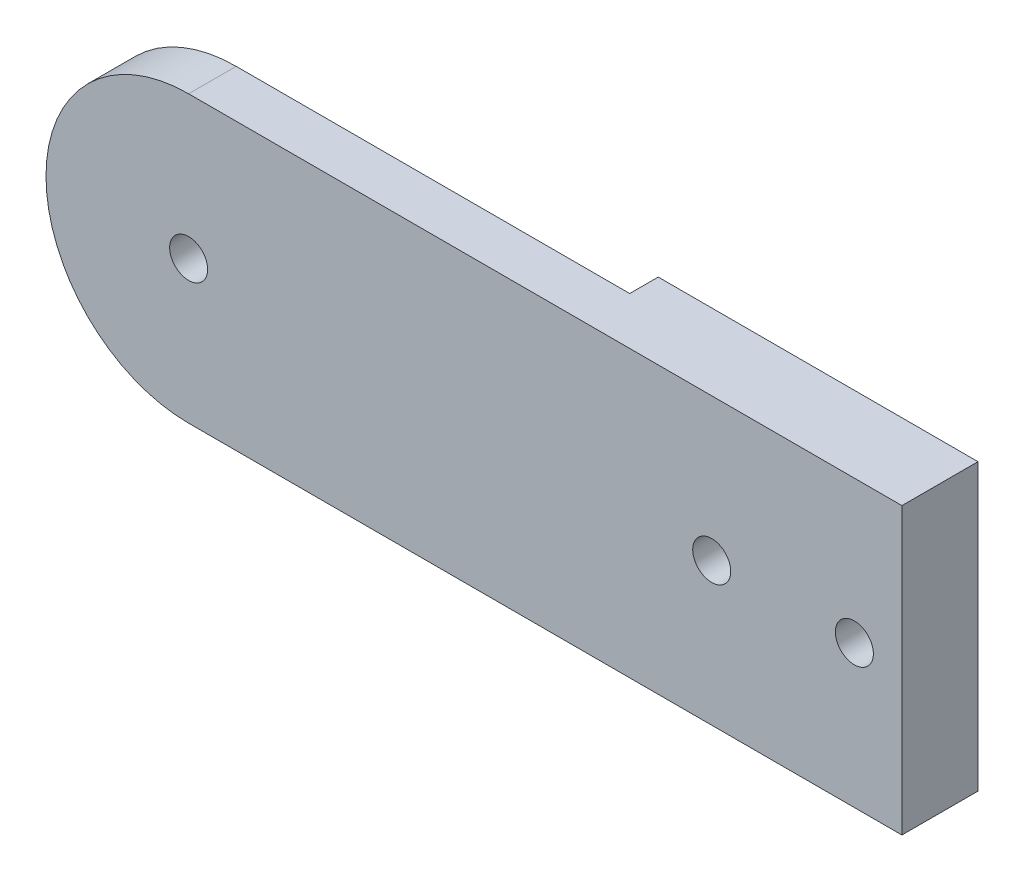
ISO-10303-21;
HEADER;
FILE_DESCRIPTION(('STEP AP214'),'2;1');
FILE_NAME('part.step','',(''),(''),'','','');
FILE_SCHEMA(('AUTOMOTIVE_DESIGN { 1 0 10303 214 1 1 1 1 }'));
ENDSEC;
DATA;
#1=APPLICATION_CONTEXT('core data for automotive mechanical design processes');
#2=APPLICATION_PROTOCOL_DEFINITION('international standard','automotive_design',2000,#1);
#3=PRODUCT_CONTEXT('',#1,'mechanical');
#4=PRODUCT('Part','Part','',(#3));
#5=PRODUCT_RELATED_PRODUCT_CATEGORY('part','',(#4));
#6=PRODUCT_DEFINITION_FORMATION('','',#4);
#7=PRODUCT_DEFINITION_CONTEXT('part definition',#1,'design');
#8=PRODUCT_DEFINITION('design','',#6,#7);
#9=PRODUCT_DEFINITION_SHAPE('','',#8);
#10=(LENGTH_UNIT() NAMED_UNIT(*) SI_UNIT(.MILLI.,.METRE.));
#11=(NAMED_UNIT(*) PLANE_ANGLE_UNIT() SI_UNIT($,.RADIAN.));
#12=(NAMED_UNIT(*) SI_UNIT($,.STERADIAN.) SOLID_ANGLE_UNIT());
#13=UNCERTAINTY_MEASURE_WITH_UNIT(LENGTH_MEASURE(1.E-05),#10,'distance_accuracy_value','');
#14=(GEOMETRIC_REPRESENTATION_CONTEXT(3) GLOBAL_UNCERTAINTY_ASSIGNED_CONTEXT((#13)) GLOBAL_UNIT_ASSIGNED_CONTEXT((#10,
#11,#12)) REPRESENTATION_CONTEXT('',''));
#15=CARTESIAN_POINT('',(0.,0.,0.));
#16=DIRECTION('',(0.,0.,1.));
#17=DIRECTION('',(1.,0.,0.));
#18=AXIS2_PLACEMENT_3D('',#15,#16,#17);
#19=CARTESIAN_POINT('',(-30.,0.,0.));
#20=DIRECTION('',(0.,0.,1.));
#21=DIRECTION('',(1.,0.,0.));
#22=AXIS2_PLACEMENT_3D('',#19,#20,#21);
#23=PLANE('',#22);
#24=CARTESIAN_POINT('',(-30.,0.,0.));
#25=DIRECTION('',(0.,0.,1.));
#26=DIRECTION('',(1.,0.,0.));
#27=AXIS2_PLACEMENT_3D('',#24,#25,#26);
#28=CIRCLE('',#27,2.);
#29=CARTESIAN_POINT('',(-28.,0.,0.));
#30=VERTEX_POINT('',#29);
#31=EDGE_CURVE('E192',#30,#30,#28,.T.);
#32=ORIENTED_EDGE('',*,*,#31,.T.);
#33=EDGE_LOOP('',(#32));
#34=FACE_BOUND('',#33,.T.);
#35=DIRECTION('',(0.,1.,0.));
#36=VECTOR('',#35,1.);
#37=CARTESIAN_POINT('',(11.3768645429779,15.,0.));
#38=LINE('',#37,#36);
#39=CARTESIAN_POINT('',(11.3768645429779,-15.,0.));
#40=VERTEX_POINT('',#39);
#41=CARTESIAN_POINT('',(11.3768645429779,15.,0.));
#42=VERTEX_POINT('',#41);
#43=EDGE_CURVE('E49',#40,#42,#38,.T.);
#44=ORIENTED_EDGE('',*,*,#43,.F.);
#45=DIRECTION('',(1.,0.,0.));
#46=VECTOR('',#45,1.);
#47=CARTESIAN_POINT('',(-30.,-15.,0.));
#48=LINE('',#47,#46);
#49=CARTESIAN_POINT('',(-30.,-15.,0.));
#50=VERTEX_POINT('',#49);
#51=EDGE_CURVE('E140',#50,#40,#48,.T.);
#52=ORIENTED_EDGE('',*,*,#51,.F.);
#53=CARTESIAN_POINT('',(-30.,0.,0.));
#54=DIRECTION('',(0.,0.,1.));
#55=DIRECTION('',(1.,0.,0.));
#56=AXIS2_PLACEMENT_3D('',#53,#54,#55);
#57=CIRCLE('',#56,15.);
#58=CARTESIAN_POINT('',(-30.,15.,0.));
#59=VERTEX_POINT('',#58);
#60=EDGE_CURVE('E74',#59,#50,#57,.T.);
#61=ORIENTED_EDGE('',*,*,#60,.F.);
#62=DIRECTION('',(-1.,0.,0.));
#63=VECTOR('',#62,1.);
#64=CARTESIAN_POINT('',(-30.,15.,0.));
#65=LINE('',#64,#63);
#66=EDGE_CURVE('E136',#42,#59,#65,.T.);
#67=ORIENTED_EDGE('',*,*,#66,.F.);
#68=EDGE_LOOP('',(#44,#52,#61,#67));
#69=FACE_BOUND('',#68,.T.);
#70=ADVANCED_FACE('F34',(#34,#69),#23,.F.);
#71=CARTESIAN_POINT('',(45.,15.,5.));
#72=DIRECTION('',(-1.,0.,0.));
#73=DIRECTION('',(0.,0.,1.));
#74=AXIS2_PLACEMENT_3D('',#71,#72,#73);
#75=PLANE('',#74);
#76=DIRECTION('',(0.,0.,-1.));
#77=VECTOR('',#76,1.);
#78=CARTESIAN_POINT('',(45.,-15.,5.));
#79=LINE('',#78,#77);
#80=CARTESIAN_POINT('',(45.,-15.,5.));
#81=VERTEX_POINT('',#80);
#82=CARTESIAN_POINT('',(45.,-15.,-3.));
#83=VERTEX_POINT('',#82);
#84=EDGE_CURVE('E97',#81,#83,#79,.T.);
#85=ORIENTED_EDGE('',*,*,#84,.T.);
#86=DIRECTION('',(0.,-1.,0.));
#87=VECTOR('',#86,1.);
#88=CARTESIAN_POINT('',(45.,15.,-3.));
#89=LINE('',#88,#87);
#90=CARTESIAN_POINT('',(45.,15.,-3.));
#91=VERTEX_POINT('',#90);
#92=EDGE_CURVE('E101',#91,#83,#89,.T.);
#93=ORIENTED_EDGE('',*,*,#92,.F.);
#94=DIRECTION('',(0.,0.,-1.));
#95=VECTOR('',#94,1.);
#96=CARTESIAN_POINT('',(45.,15.,5.));
#97=LINE('',#96,#95);
#98=CARTESIAN_POINT('',(45.,15.,5.));
#99=VERTEX_POINT('',#98);
#100=EDGE_CURVE('E11',#99,#91,#97,.T.);
#101=ORIENTED_EDGE('',*,*,#100,.F.);
#102=DIRECTION('',(0.,1.,0.));
#103=VECTOR('',#102,1.);
#104=CARTESIAN_POINT('',(45.,15.,5.));
#105=LINE('',#104,#103);
#106=EDGE_CURVE('E102',#81,#99,#105,.T.);
#107=ORIENTED_EDGE('',*,*,#106,.F.);
#108=EDGE_LOOP('',(#85,#93,#101,#107));
#109=FACE_BOUND('',#108,.T.);
#110=ADVANCED_FACE('F36',(#109),#75,.F.);
#111=CARTESIAN_POINT('',(-30.,15.,5.));
#112=DIRECTION('',(0.,-1.,0.));
#113=DIRECTION('',(1.,0.,0.));
#114=AXIS2_PLACEMENT_3D('',#111,#112,#113);
#115=PLANE('',#114);
#116=ORIENTED_EDGE('',*,*,#100,.T.);
#117=DIRECTION('',(1.,0.,0.));
#118=VECTOR('',#117,1.);
#119=CARTESIAN_POINT('',(45.,15.,-3.));
#120=LINE('',#119,#118);
#121=CARTESIAN_POINT('',(11.3768645429779,15.,-3.));
#122=VERTEX_POINT('',#121);
#123=EDGE_CURVE('E118',#122,#91,#120,.T.);
#124=ORIENTED_EDGE('',*,*,#123,.F.);
#125=DIRECTION('',(0.,0.,1.));
#126=VECTOR('',#125,1.);
#127=CARTESIAN_POINT('',(11.3768645429779,15.,-3.));
#128=LINE('',#127,#126);
#129=EDGE_CURVE('E127',#122,#42,#128,.T.);
#130=ORIENTED_EDGE('',*,*,#129,.T.);
#131=ORIENTED_EDGE('',*,*,#66,.T.);
#132=DIRECTION('',(0.,0.,-1.));
#133=VECTOR('',#132,1.);
#134=CARTESIAN_POINT('',(-30.,15.,5.));
#135=LINE('',#134,#133);
#136=CARTESIAN_POINT('',(-30.,15.,5.));
#137=VERTEX_POINT('',#136);
#138=EDGE_CURVE('E42',#137,#59,#135,.T.);
#139=ORIENTED_EDGE('',*,*,#138,.F.);
#140=DIRECTION('',(-1.,0.,0.));
#141=VECTOR('',#140,1.);
#142=CARTESIAN_POINT('',(-30.,15.,5.));
#143=LINE('',#142,#141);
#144=EDGE_CURVE('E81',#99,#137,#143,.T.);
#145=ORIENTED_EDGE('',*,*,#144,.F.);
#146=EDGE_LOOP('',(#116,#124,#130,#131,#139,#145));
#147=FACE_BOUND('',#146,.T.);
#148=ADVANCED_FACE('F153',(#147),#115,.F.);
#149=CARTESIAN_POINT('',(-30.,0.,5.));
#150=DIRECTION('',(0.,0.,-1.));
#151=DIRECTION('',(-1.,0.,0.));
#152=AXIS2_PLACEMENT_3D('',#149,#150,#151);
#153=CYLINDRICAL_SURFACE('',#152,15.);
#154=ORIENTED_EDGE('',*,*,#60,.T.);
#155=DIRECTION('',(0.,0.,-1.));
#156=VECTOR('',#155,1.);
#157=CARTESIAN_POINT('',(-30.,-15.,5.));
#158=LINE('',#157,#156);
#159=CARTESIAN_POINT('',(-30.,-15.,5.));
#160=VERTEX_POINT('',#159);
#161=EDGE_CURVE('E104',#160,#50,#158,.T.);
#162=ORIENTED_EDGE('',*,*,#161,.F.);
#163=CARTESIAN_POINT('',(-30.,0.,5.));
#164=DIRECTION('',(0.,0.,1.));
#165=DIRECTION('',(1.,0.,0.));
#166=AXIS2_PLACEMENT_3D('',#163,#164,#165);
#167=CIRCLE('',#166,15.);
#168=EDGE_CURVE('E142',#137,#160,#167,.T.);
#169=ORIENTED_EDGE('',*,*,#168,.F.);
#170=ORIENTED_EDGE('',*,*,#138,.T.);
#171=EDGE_LOOP('',(#154,#162,#169,#170));
#172=FACE_BOUND('',#171,.T.);
#173=ADVANCED_FACE('F149',(#172),#153,.T.);
#174=CARTESIAN_POINT('',(-30.,-15.,5.));
#175=DIRECTION('',(0.,1.,0.));
#176=DIRECTION('',(-1.,0.,0.));
#177=AXIS2_PLACEMENT_3D('',#174,#175,#176);
#178=PLANE('',#177);
#179=ORIENTED_EDGE('',*,*,#51,.T.);
#180=DIRECTION('',(0.,0.,1.));
#181=VECTOR('',#180,1.);
#182=CARTESIAN_POINT('',(11.3768645429779,-15.,-3.));
#183=LINE('',#182,#181);
#184=CARTESIAN_POINT('',(11.3768645429779,-15.,-3.));
#185=VERTEX_POINT('',#184);
#186=EDGE_CURVE('E110',#185,#40,#183,.T.);
#187=ORIENTED_EDGE('',*,*,#186,.F.);
#188=DIRECTION('',(-1.,0.,0.));
#189=VECTOR('',#188,1.);
#190=CARTESIAN_POINT('',(45.,-15.,-3.));
#191=LINE('',#190,#189);
#192=EDGE_CURVE('E107',#83,#185,#191,.T.);
#193=ORIENTED_EDGE('',*,*,#192,.F.);
#194=ORIENTED_EDGE('',*,*,#84,.F.);
#195=DIRECTION('',(1.,0.,0.));
#196=VECTOR('',#195,1.);
#197=CARTESIAN_POINT('',(-30.,-15.,5.));
#198=LINE('',#197,#196);
#199=EDGE_CURVE('E58',#160,#81,#198,.T.);
#200=ORIENTED_EDGE('',*,*,#199,.F.);
#201=ORIENTED_EDGE('',*,*,#161,.T.);
#202=EDGE_LOOP('',(#179,#187,#193,#194,#200,#201));
#203=FACE_BOUND('',#202,.T.);
#204=ADVANCED_FACE('F108',(#203),#178,.F.);
#205=CARTESIAN_POINT('',(-30.,0.,5.));
#206=DIRECTION('',(0.,0.,1.));
#207=DIRECTION('',(1.,0.,0.));
#208=AXIS2_PLACEMENT_3D('',#205,#206,#207);
#209=PLANE('',#208);
#210=CARTESIAN_POINT('',(-30.,0.,5.));
#211=DIRECTION('',(0.,0.,1.));
#212=DIRECTION('',(1.,0.,0.));
#213=AXIS2_PLACEMENT_3D('',#210,#211,#212);
#214=CIRCLE('',#213,2.);
#215=CARTESIAN_POINT('',(-28.,0.,5.));
#216=VERTEX_POINT('',#215);
#217=EDGE_CURVE('E184',#216,#216,#214,.T.);
#218=ORIENTED_EDGE('',*,*,#217,.F.);
#219=EDGE_LOOP('',(#218));
#220=FACE_BOUND('',#219,.T.);
#221=CARTESIAN_POINT('',(40.,0.,5.));
#222=DIRECTION('',(0.,0.,-1.));
#223=DIRECTION('',(-1.,0.,0.));
#224=AXIS2_PLACEMENT_3D('',#221,#222,#223);
#225=CIRCLE('',#224,2.);
#226=CARTESIAN_POINT('',(38.,0.,5.));
#227=VERTEX_POINT('',#226);
#228=EDGE_CURVE('E133',#227,#227,#225,.T.);
#229=ORIENTED_EDGE('',*,*,#228,.T.);
#230=EDGE_LOOP('',(#229));
#231=FACE_BOUND('',#230,.T.);
#232=CARTESIAN_POINT('',(25.,0.,5.));
#233=DIRECTION('',(0.,0.,-1.));
#234=DIRECTION('',(-1.,0.,0.));
#235=AXIS2_PLACEMENT_3D('',#232,#233,#234);
#236=CIRCLE('',#235,2.);
#237=CARTESIAN_POINT('',(23.,0.,5.));
#238=VERTEX_POINT('',#237);
#239=EDGE_CURVE('E132',#238,#238,#236,.T.);
#240=ORIENTED_EDGE('',*,*,#239,.T.);
#241=EDGE_LOOP('',(#240));
#242=FACE_BOUND('',#241,.T.);
#243=ORIENTED_EDGE('',*,*,#106,.T.);
#244=ORIENTED_EDGE('',*,*,#144,.T.);
#245=ORIENTED_EDGE('',*,*,#168,.T.);
#246=ORIENTED_EDGE('',*,*,#199,.T.);
#247=EDGE_LOOP('',(#243,#244,#245,#246));
#248=FACE_BOUND('',#247,.T.);
#249=ADVANCED_FACE('F168',(#220,#231,#242,#248),#209,.T.);
#250=CARTESIAN_POINT('',(25.,0.,5.));
#251=DIRECTION('',(0.,0.,-1.));
#252=DIRECTION('',(-1.,0.,0.));
#253=AXIS2_PLACEMENT_3D('',#250,#251,#252);
#254=CYLINDRICAL_SURFACE('',#253,2.);
#255=ORIENTED_EDGE('',*,*,#239,.F.);
#256=EDGE_LOOP('',(#255));
#257=FACE_BOUND('',#256,.T.);
#258=CARTESIAN_POINT('',(25.,0.,-3.));
#259=DIRECTION('',(0.,0.,-1.));
#260=DIRECTION('',(-1.,0.,0.));
#261=AXIS2_PLACEMENT_3D('',#258,#259,#260);
#262=CIRCLE('',#261,2.);
#263=CARTESIAN_POINT('',(23.,0.,-3.));
#264=VERTEX_POINT('',#263);
#265=EDGE_CURVE('E123',#264,#264,#262,.T.);
#266=ORIENTED_EDGE('',*,*,#265,.T.);
#267=EDGE_LOOP('',(#266));
#268=FACE_BOUND('',#267,.T.);
#269=ADVANCED_FACE('F174',(#257,#268),#254,.F.);
#270=CARTESIAN_POINT('',(40.,0.,5.));
#271=DIRECTION('',(0.,0.,-1.));
#272=DIRECTION('',(-1.,0.,0.));
#273=AXIS2_PLACEMENT_3D('',#270,#271,#272);
#274=CYLINDRICAL_SURFACE('',#273,2.);
#275=ORIENTED_EDGE('',*,*,#228,.F.);
#276=EDGE_LOOP('',(#275));
#277=FACE_BOUND('',#276,.T.);
#278=CARTESIAN_POINT('',(40.,0.,-3.));
#279=DIRECTION('',(0.,0.,-1.));
#280=DIRECTION('',(-1.,0.,0.));
#281=AXIS2_PLACEMENT_3D('',#278,#279,#280);
#282=CIRCLE('',#281,2.);
#283=CARTESIAN_POINT('',(38.,0.,-3.));
#284=VERTEX_POINT('',#283);
#285=EDGE_CURVE('E120',#284,#284,#282,.T.);
#286=ORIENTED_EDGE('',*,*,#285,.T.);
#287=EDGE_LOOP('',(#286));
#288=FACE_BOUND('',#287,.T.);
#289=ADVANCED_FACE('F179',(#277,#288),#274,.F.);
#290=CARTESIAN_POINT('',(0.,0.,-3.));
#291=DIRECTION('',(0.,0.,-1.));
#292=DIRECTION('',(-1.,0.,0.));
#293=AXIS2_PLACEMENT_3D('',#290,#291,#292);
#294=PLANE('',#293);
#295=ORIENTED_EDGE('',*,*,#285,.F.);
#296=EDGE_LOOP('',(#295));
#297=FACE_BOUND('',#296,.T.);
#298=ORIENTED_EDGE('',*,*,#265,.F.);
#299=EDGE_LOOP('',(#298));
#300=FACE_BOUND('',#299,.T.);
#301=ORIENTED_EDGE('',*,*,#92,.T.);
#302=ORIENTED_EDGE('',*,*,#192,.T.);
#303=DIRECTION('',(0.,1.,0.));
#304=VECTOR('',#303,1.);
#305=CARTESIAN_POINT('',(11.3768645429779,15.,-3.));
#306=LINE('',#305,#304);
#307=EDGE_CURVE('E113',#185,#122,#306,.T.);
#308=ORIENTED_EDGE('',*,*,#307,.T.);
#309=ORIENTED_EDGE('',*,*,#123,.T.);
#310=EDGE_LOOP('',(#301,#302,#308,#309));
#311=FACE_BOUND('',#310,.T.);
#312=ADVANCED_FACE('F116',(#297,#300,#311),#294,.T.);
#313=CARTESIAN_POINT('',(11.3768645429779,15.,-3.));
#314=DIRECTION('',(1.,0.,0.));
#315=DIRECTION('',(0.,0.,-1.));
#316=AXIS2_PLACEMENT_3D('',#313,#314,#315);
#317=PLANE('',#316);
#318=ORIENTED_EDGE('',*,*,#43,.T.);
#319=ORIENTED_EDGE('',*,*,#129,.F.);
#320=ORIENTED_EDGE('',*,*,#307,.F.);
#321=ORIENTED_EDGE('',*,*,#186,.T.);
#322=EDGE_LOOP('',(#318,#319,#320,#321));
#323=FACE_BOUND('',#322,.T.);
#324=ADVANCED_FACE('F151',(#323),#317,.F.);
#325=CARTESIAN_POINT('',(-30.,0.,-3.));
#326=DIRECTION('',(0.,0.,1.));
#327=DIRECTION('',(1.,0.,0.));
#328=AXIS2_PLACEMENT_3D('',#325,#326,#327);
#329=CYLINDRICAL_SURFACE('',#328,2.);
#330=ORIENTED_EDGE('',*,*,#217,.T.);
#331=EDGE_LOOP('',(#330));
#332=FACE_BOUND('',#331,.T.);
#333=ORIENTED_EDGE('',*,*,#31,.F.);
#334=EDGE_LOOP('',(#333));
#335=FACE_BOUND('',#334,.T.);
#336=ADVANCED_FACE('F198',(#332,#335),#329,.F.);
#337=CLOSED_SHELL('',(#70,#110,#148,#173,#204,#249,#269,#289,#312,#324,#336));
#338=MANIFOLD_SOLID_BREP('B2',#337);
#339=ADVANCED_BREP_SHAPE_REPRESENTATION('',(#18,#338),#14);
#340=SHAPE_DEFINITION_REPRESENTATION(#9,#339);
ENDSEC;
END-ISO-10303-21;
